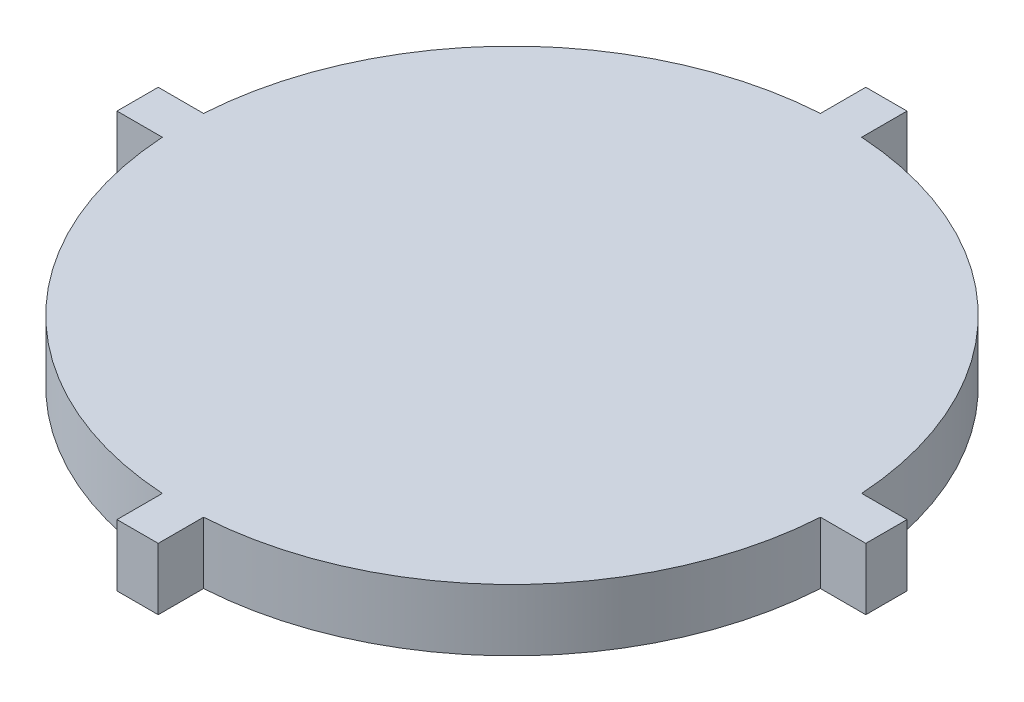
ISO-10303-21;
HEADER;
FILE_DESCRIPTION(('STEP AP214'),'2;1');
FILE_NAME('part.step','',(''),(''),'','','');
FILE_SCHEMA(('AUTOMOTIVE_DESIGN { 1 0 10303 214 1 1 1 1 }'));
ENDSEC;
DATA;
#1=APPLICATION_CONTEXT('core data for automotive mechanical design processes');
#2=APPLICATION_PROTOCOL_DEFINITION('international standard','automotive_design',2000,#1);
#3=PRODUCT_CONTEXT('',#1,'mechanical');
#4=PRODUCT('Part','Part','',(#3));
#5=PRODUCT_RELATED_PRODUCT_CATEGORY('part','',(#4));
#6=PRODUCT_DEFINITION_FORMATION('','',#4);
#7=PRODUCT_DEFINITION_CONTEXT('part definition',#1,'design');
#8=PRODUCT_DEFINITION('design','',#6,#7);
#9=PRODUCT_DEFINITION_SHAPE('','',#8);
#10=(LENGTH_UNIT() NAMED_UNIT(*) SI_UNIT(.MILLI.,.METRE.));
#11=(NAMED_UNIT(*) PLANE_ANGLE_UNIT() SI_UNIT($,.RADIAN.));
#12=(NAMED_UNIT(*) SI_UNIT($,.STERADIAN.) SOLID_ANGLE_UNIT());
#13=UNCERTAINTY_MEASURE_WITH_UNIT(LENGTH_MEASURE(1.E-05),#10,'distance_accuracy_value','');
#14=(GEOMETRIC_REPRESENTATION_CONTEXT(3) GLOBAL_UNCERTAINTY_ASSIGNED_CONTEXT((#13)) GLOBAL_UNIT_ASSIGNED_CONTEXT((#10,
#11,#12)) REPRESENTATION_CONTEXT('',''));
#15=CARTESIAN_POINT('',(0.,0.,0.));
#16=DIRECTION('',(0.,0.,1.));
#17=DIRECTION('',(1.,0.,0.));
#18=AXIS2_PLACEMENT_3D('',#15,#16,#17);
#19=CARTESIAN_POINT('',(0.,19.05,0.));
#20=DIRECTION('',(0.,-1.,0.));
#21=DIRECTION('',(0.,0.,-1.));
#22=AXIS2_PLACEMENT_3D('',#19,#20,#21);
#23=CYLINDRICAL_SURFACE('',#22,101.6);
#24=CARTESIAN_POINT('',(0.,0.,0.));
#25=DIRECTION('',(0.,1.,0.));
#26=DIRECTION('',(0.,0.,1.));
#27=AXIS2_PLACEMENT_3D('',#24,#25,#26);
#28=CIRCLE('',#27,101.6);
#29=CARTESIAN_POINT('',(101.401368333963,0.,-6.35));
#30=VERTEX_POINT('',#29);
#31=CARTESIAN_POINT('',(6.35000000000001,0.,-101.401368333963));
#32=VERTEX_POINT('',#31);
#33=EDGE_CURVE('E187',#30,#32,#28,.T.);
#34=ORIENTED_EDGE('',*,*,#33,.T.);
#35=DIRECTION('',(0.,-1.,0.));
#36=VECTOR('',#35,1.);
#37=CARTESIAN_POINT('',(6.35000000000001,19.05,-101.401368333963));
#38=LINE('',#37,#36);
#39=CARTESIAN_POINT('',(6.35000000000001,19.05,-101.401368333963));
#40=VERTEX_POINT('',#39);
#41=EDGE_CURVE('E11',#40,#32,#38,.T.);
#42=ORIENTED_EDGE('',*,*,#41,.F.);
#43=CARTESIAN_POINT('',(0.,19.05,0.));
#44=DIRECTION('',(0.,1.,0.));
#45=DIRECTION('',(0.,0.,1.));
#46=AXIS2_PLACEMENT_3D('',#43,#44,#45);
#47=CIRCLE('',#46,101.6);
#48=CARTESIAN_POINT('',(101.401368333963,19.05,-6.35));
#49=VERTEX_POINT('',#48);
#50=EDGE_CURVE('E217',#49,#40,#47,.T.);
#51=ORIENTED_EDGE('',*,*,#50,.F.);
#52=DIRECTION('',(0.,-1.,0.));
#53=VECTOR('',#52,1.);
#54=CARTESIAN_POINT('',(101.401368333963,19.05,-6.35));
#55=LINE('',#54,#53);
#56=EDGE_CURVE('E183',#49,#30,#55,.T.);
#57=ORIENTED_EDGE('',*,*,#56,.T.);
#58=EDGE_LOOP('',(#34,#42,#51,#57));
#59=FACE_BOUND('',#58,.T.);
#60=ADVANCED_FACE('F43',(#59),#23,.T.);
#61=CARTESIAN_POINT('',(6.35000000000001,19.05,-101.401368333963));
#62=DIRECTION('',(-1.,0.,0.));
#63=DIRECTION('',(0.,0.,1.));
#64=AXIS2_PLACEMENT_3D('',#61,#62,#63);
#65=PLANE('',#64);
#66=DIRECTION('',(0.,0.,-1.));
#67=VECTOR('',#66,1.);
#68=CARTESIAN_POINT('',(6.35000000000001,0.,-101.401368333963));
#69=LINE('',#68,#67);
#70=CARTESIAN_POINT('',(6.35,0.,-115.371368333963));
#71=VERTEX_POINT('',#70);
#72=EDGE_CURVE('E190',#32,#71,#69,.T.);
#73=ORIENTED_EDGE('',*,*,#72,.T.);
#74=DIRECTION('',(0.,-1.,0.));
#75=VECTOR('',#74,1.);
#76=CARTESIAN_POINT('',(6.35,19.05,-115.371368333963));
#77=LINE('',#76,#75);
#78=CARTESIAN_POINT('',(6.35,19.05,-115.371368333963));
#79=VERTEX_POINT('',#78);
#80=EDGE_CURVE('E51',#79,#71,#77,.T.);
#81=ORIENTED_EDGE('',*,*,#80,.F.);
#82=DIRECTION('',(0.,0.,-1.));
#83=VECTOR('',#82,1.);
#84=CARTESIAN_POINT('',(6.35000000000001,19.05,-101.401368333963));
#85=LINE('',#84,#83);
#86=EDGE_CURVE('E125',#40,#79,#85,.T.);
#87=ORIENTED_EDGE('',*,*,#86,.F.);
#88=ORIENTED_EDGE('',*,*,#41,.T.);
#89=EDGE_LOOP('',(#73,#81,#87,#88));
#90=FACE_BOUND('',#89,.T.);
#91=ADVANCED_FACE('F315',(#90),#65,.F.);
#92=CARTESIAN_POINT('',(-6.35,19.05,-115.371368333963));
#93=DIRECTION('',(0.,0.,1.));
#94=DIRECTION('',(1.,0.,0.));
#95=AXIS2_PLACEMENT_3D('',#92,#93,#94);
#96=PLANE('',#95);
#97=DIRECTION('',(-1.,0.,0.));
#98=VECTOR('',#97,1.);
#99=CARTESIAN_POINT('',(-6.35,0.,-115.371368333963));
#100=LINE('',#99,#98);
#101=CARTESIAN_POINT('',(-6.35,0.,-115.371368333963));
#102=VERTEX_POINT('',#101);
#103=EDGE_CURVE('E192',#71,#102,#100,.T.);
#104=ORIENTED_EDGE('',*,*,#103,.T.);
#105=DIRECTION('',(0.,-1.,0.));
#106=VECTOR('',#105,1.);
#107=CARTESIAN_POINT('',(-6.35,19.05,-115.371368333963));
#108=LINE('',#107,#106);
#109=CARTESIAN_POINT('',(-6.35,19.05,-115.371368333963));
#110=VERTEX_POINT('',#109);
#111=EDGE_CURVE('E248',#110,#102,#108,.T.);
#112=ORIENTED_EDGE('',*,*,#111,.F.);
#113=DIRECTION('',(-1.,0.,0.));
#114=VECTOR('',#113,1.);
#115=CARTESIAN_POINT('',(-6.35,19.05,-115.371368333963));
#116=LINE('',#115,#114);
#117=EDGE_CURVE('E256',#79,#110,#116,.T.);
#118=ORIENTED_EDGE('',*,*,#117,.F.);
#119=ORIENTED_EDGE('',*,*,#80,.T.);
#120=EDGE_LOOP('',(#104,#112,#118,#119));
#121=FACE_BOUND('',#120,.T.);
#122=ADVANCED_FACE('F254',(#121),#96,.F.);
#123=CARTESIAN_POINT('',(-6.34999999999999,19.05,-101.401368333963));
#124=DIRECTION('',(1.,0.,0.));
#125=DIRECTION('',(0.,0.,-1.));
#126=AXIS2_PLACEMENT_3D('',#123,#124,#125);
#127=PLANE('',#126);
#128=DIRECTION('',(0.,0.,1.));
#129=VECTOR('',#128,1.);
#130=CARTESIAN_POINT('',(-6.34999999999999,0.,-101.401368333963));
#131=LINE('',#130,#129);
#132=CARTESIAN_POINT('',(-6.34999999999999,0.,-101.401368333963));
#133=VERTEX_POINT('',#132);
#134=EDGE_CURVE('E194',#102,#133,#131,.T.);
#135=ORIENTED_EDGE('',*,*,#134,.T.);
#136=DIRECTION('',(0.,-1.,0.));
#137=VECTOR('',#136,1.);
#138=CARTESIAN_POINT('',(-6.34999999999999,19.05,-101.401368333963));
#139=LINE('',#138,#137);
#140=CARTESIAN_POINT('',(-6.34999999999999,19.05,-101.401368333963));
#141=VERTEX_POINT('',#140);
#142=EDGE_CURVE('E245',#141,#133,#139,.T.);
#143=ORIENTED_EDGE('',*,*,#142,.F.);
#144=DIRECTION('',(0.,0.,1.));
#145=VECTOR('',#144,1.);
#146=CARTESIAN_POINT('',(-6.34999999999999,19.05,-101.401368333963));
#147=LINE('',#146,#145);
#148=EDGE_CURVE('E274',#110,#141,#147,.T.);
#149=ORIENTED_EDGE('',*,*,#148,.F.);
#150=ORIENTED_EDGE('',*,*,#111,.T.);
#151=EDGE_LOOP('',(#135,#143,#149,#150));
#152=FACE_BOUND('',#151,.T.);
#153=ADVANCED_FACE('F265',(#152),#127,.F.);
#154=CARTESIAN_POINT('',(0.,19.05,0.));
#155=DIRECTION('',(0.,-1.,0.));
#156=DIRECTION('',(0.,0.,-1.));
#157=AXIS2_PLACEMENT_3D('',#154,#155,#156);
#158=CYLINDRICAL_SURFACE('',#157,101.6);
#159=CARTESIAN_POINT('',(0.,0.,0.));
#160=DIRECTION('',(0.,1.,0.));
#161=DIRECTION('',(0.,0.,1.));
#162=AXIS2_PLACEMENT_3D('',#159,#160,#161);
#163=CIRCLE('',#162,101.6);
#164=CARTESIAN_POINT('',(-101.401368333963,0.,-6.34999999999998));
#165=VERTEX_POINT('',#164);
#166=EDGE_CURVE('E196',#133,#165,#163,.T.);
#167=ORIENTED_EDGE('',*,*,#166,.T.);
#168=DIRECTION('',(0.,-1.,0.));
#169=VECTOR('',#168,1.);
#170=CARTESIAN_POINT('',(-101.401368333963,19.05,-6.34999999999998));
#171=LINE('',#170,#169);
#172=CARTESIAN_POINT('',(-101.401368333963,19.05,-6.34999999999998));
#173=VERTEX_POINT('',#172);
#174=EDGE_CURVE('E242',#173,#165,#171,.T.);
#175=ORIENTED_EDGE('',*,*,#174,.F.);
#176=CARTESIAN_POINT('',(0.,19.05,0.));
#177=DIRECTION('',(0.,1.,0.));
#178=DIRECTION('',(0.,0.,1.));
#179=AXIS2_PLACEMENT_3D('',#176,#177,#178);
#180=CIRCLE('',#179,101.6);
#181=EDGE_CURVE('E271',#141,#173,#180,.T.);
#182=ORIENTED_EDGE('',*,*,#181,.F.);
#183=ORIENTED_EDGE('',*,*,#142,.T.);
#184=EDGE_LOOP('',(#167,#175,#182,#183));
#185=FACE_BOUND('',#184,.T.);
#186=ADVANCED_FACE('F269',(#185),#158,.T.);
#187=CARTESIAN_POINT('',(-101.401368333963,19.05,-6.35));
#188=DIRECTION('',(0.,0.,1.));
#189=DIRECTION('',(1.,0.,0.));
#190=AXIS2_PLACEMENT_3D('',#187,#188,#189);
#191=PLANE('',#190);
#192=DIRECTION('',(-1.,0.,0.));
#193=VECTOR('',#192,1.);
#194=CARTESIAN_POINT('',(-101.401368333963,0.,-6.35));
#195=LINE('',#194,#193);
#196=CARTESIAN_POINT('',(-115.371368333963,0.,-6.35000000000072));
#197=VERTEX_POINT('',#196);
#198=EDGE_CURVE('E198',#165,#197,#195,.T.);
#199=ORIENTED_EDGE('',*,*,#198,.T.);
#200=DIRECTION('',(0.,-1.,0.));
#201=VECTOR('',#200,1.);
#202=CARTESIAN_POINT('',(-115.371368333963,19.05,-6.35000000000072));
#203=LINE('',#202,#201);
#204=CARTESIAN_POINT('',(-115.371368333963,19.05,-6.35000000000072));
#205=VERTEX_POINT('',#204);
#206=EDGE_CURVE('E239',#205,#197,#203,.T.);
#207=ORIENTED_EDGE('',*,*,#206,.F.);
#208=DIRECTION('',(-1.,0.,0.));
#209=VECTOR('',#208,1.);
#210=CARTESIAN_POINT('',(-101.401368333963,19.05,-6.35));
#211=LINE('',#210,#209);
#212=EDGE_CURVE('E273',#173,#205,#211,.T.);
#213=ORIENTED_EDGE('',*,*,#212,.F.);
#214=ORIENTED_EDGE('',*,*,#174,.T.);
#215=EDGE_LOOP('',(#199,#207,#213,#214));
#216=FACE_BOUND('',#215,.T.);
#217=ADVANCED_FACE('F328',(#216),#191,.F.);
#218=CARTESIAN_POINT('',(-115.371368333963,19.05,-6.35000000000072));
#219=DIRECTION('',(1.,0.,0.));
#220=DIRECTION('',(0.,0.,-1.));
#221=AXIS2_PLACEMENT_3D('',#218,#219,#220);
#222=PLANE('',#221);
#223=DIRECTION('',(0.,0.,1.));
#224=VECTOR('',#223,1.);
#225=CARTESIAN_POINT('',(-115.371368333963,0.,-6.35000000000072));
#226=LINE('',#225,#224);
#227=CARTESIAN_POINT('',(-115.371368333963,0.,6.34999999999928));
#228=VERTEX_POINT('',#227);
#229=EDGE_CURVE('E200',#197,#228,#226,.T.);
#230=ORIENTED_EDGE('',*,*,#229,.T.);
#231=DIRECTION('',(0.,-1.,0.));
#232=VECTOR('',#231,1.);
#233=CARTESIAN_POINT('',(-115.371368333963,19.05,6.34999999999928));
#234=LINE('',#233,#232);
#235=CARTESIAN_POINT('',(-115.371368333963,19.05,6.34999999999928));
#236=VERTEX_POINT('',#235);
#237=EDGE_CURVE('E236',#236,#228,#234,.T.);
#238=ORIENTED_EDGE('',*,*,#237,.F.);
#239=DIRECTION('',(0.,0.,1.));
#240=VECTOR('',#239,1.);
#241=CARTESIAN_POINT('',(-115.371368333963,19.05,-6.35000000000072));
#242=LINE('',#241,#240);
#243=EDGE_CURVE('E276',#205,#236,#242,.T.);
#244=ORIENTED_EDGE('',*,*,#243,.F.);
#245=ORIENTED_EDGE('',*,*,#206,.T.);
#246=EDGE_LOOP('',(#230,#238,#244,#245));
#247=FACE_BOUND('',#246,.T.);
#248=ADVANCED_FACE('F331',(#247),#222,.F.);
#249=CARTESIAN_POINT('',(-101.401368333963,19.05,6.35));
#250=DIRECTION('',(0.,0.,-1.));
#251=DIRECTION('',(-1.,0.,0.));
#252=AXIS2_PLACEMENT_3D('',#249,#250,#251);
#253=PLANE('',#252);
#254=DIRECTION('',(1.,0.,0.));
#255=VECTOR('',#254,1.);
#256=CARTESIAN_POINT('',(-101.401368333963,0.,6.35));
#257=LINE('',#256,#255);
#258=CARTESIAN_POINT('',(-101.401368333963,0.,6.35));
#259=VERTEX_POINT('',#258);
#260=EDGE_CURVE('E202',#228,#259,#257,.T.);
#261=ORIENTED_EDGE('',*,*,#260,.T.);
#262=DIRECTION('',(0.,-1.,0.));
#263=VECTOR('',#262,1.);
#264=CARTESIAN_POINT('',(-101.401368333963,19.05,6.35));
#265=LINE('',#264,#263);
#266=CARTESIAN_POINT('',(-101.401368333963,19.05,6.35));
#267=VERTEX_POINT('',#266);
#268=EDGE_CURVE('E233',#267,#259,#265,.T.);
#269=ORIENTED_EDGE('',*,*,#268,.F.);
#270=DIRECTION('',(1.,0.,0.));
#271=VECTOR('',#270,1.);
#272=CARTESIAN_POINT('',(-101.401368333963,19.05,6.35));
#273=LINE('',#272,#271);
#274=EDGE_CURVE('E282',#236,#267,#273,.T.);
#275=ORIENTED_EDGE('',*,*,#274,.F.);
#276=ORIENTED_EDGE('',*,*,#237,.T.);
#277=EDGE_LOOP('',(#261,#269,#275,#276));
#278=FACE_BOUND('',#277,.T.);
#279=ADVANCED_FACE('F335',(#278),#253,.F.);
#280=CARTESIAN_POINT('',(0.,19.05,0.));
#281=DIRECTION('',(0.,-1.,0.));
#282=DIRECTION('',(0.,0.,-1.));
#283=AXIS2_PLACEMENT_3D('',#280,#281,#282);
#284=CYLINDRICAL_SURFACE('',#283,101.6);
#285=CARTESIAN_POINT('',(0.,0.,0.));
#286=DIRECTION('',(0.,1.,0.));
#287=DIRECTION('',(0.,0.,1.));
#288=AXIS2_PLACEMENT_3D('',#285,#286,#287);
#289=CIRCLE('',#288,101.6);
#290=CARTESIAN_POINT('',(-6.34999999999999,0.,101.401368333963));
#291=VERTEX_POINT('',#290);
#292=EDGE_CURVE('E204',#259,#291,#289,.T.);
#293=ORIENTED_EDGE('',*,*,#292,.T.);
#294=DIRECTION('',(0.,-1.,0.));
#295=VECTOR('',#294,1.);
#296=CARTESIAN_POINT('',(-6.34999999999999,19.05,101.401368333963));
#297=LINE('',#296,#295);
#298=CARTESIAN_POINT('',(-6.34999999999999,19.05,101.401368333963));
#299=VERTEX_POINT('',#298);
#300=EDGE_CURVE('E230',#299,#291,#297,.T.);
#301=ORIENTED_EDGE('',*,*,#300,.F.);
#302=CARTESIAN_POINT('',(0.,19.05,0.));
#303=DIRECTION('',(0.,1.,0.));
#304=DIRECTION('',(0.,0.,1.));
#305=AXIS2_PLACEMENT_3D('',#302,#303,#304);
#306=CIRCLE('',#305,101.6);
#307=EDGE_CURVE('E284',#267,#299,#306,.T.);
#308=ORIENTED_EDGE('',*,*,#307,.F.);
#309=ORIENTED_EDGE('',*,*,#268,.T.);
#310=EDGE_LOOP('',(#293,#301,#308,#309));
#311=FACE_BOUND('',#310,.T.);
#312=ADVANCED_FACE('F339',(#311),#284,.T.);
#313=CARTESIAN_POINT('',(-6.34999999999999,19.05,101.401368333963));
#314=DIRECTION('',(1.,0.,0.));
#315=DIRECTION('',(0.,0.,-1.));
#316=AXIS2_PLACEMENT_3D('',#313,#314,#315);
#317=PLANE('',#316);
#318=DIRECTION('',(0.,0.,1.));
#319=VECTOR('',#318,1.);
#320=CARTESIAN_POINT('',(-6.34999999999999,0.,101.401368333963));
#321=LINE('',#320,#319);
#322=CARTESIAN_POINT('',(-6.34999999999999,0.,115.371368333963));
#323=VERTEX_POINT('',#322);
#324=EDGE_CURVE('E206',#291,#323,#321,.T.);
#325=ORIENTED_EDGE('',*,*,#324,.T.);
#326=DIRECTION('',(0.,-1.,0.));
#327=VECTOR('',#326,1.);
#328=CARTESIAN_POINT('',(-6.34999999999999,19.05,115.371368333963));
#329=LINE('',#328,#327);
#330=CARTESIAN_POINT('',(-6.34999999999999,19.05,115.371368333963));
#331=VERTEX_POINT('',#330);
#332=EDGE_CURVE('E227',#331,#323,#329,.T.);
#333=ORIENTED_EDGE('',*,*,#332,.F.);
#334=DIRECTION('',(0.,0.,1.));
#335=VECTOR('',#334,1.);
#336=CARTESIAN_POINT('',(-6.34999999999999,19.05,101.401368333963));
#337=LINE('',#336,#335);
#338=EDGE_CURVE('E286',#299,#331,#337,.T.);
#339=ORIENTED_EDGE('',*,*,#338,.F.);
#340=ORIENTED_EDGE('',*,*,#300,.T.);
#341=EDGE_LOOP('',(#325,#333,#339,#340));
#342=FACE_BOUND('',#341,.T.);
#343=ADVANCED_FACE('F343',(#342),#317,.F.);
#344=CARTESIAN_POINT('',(-6.34999999999999,19.05,115.371368333963));
#345=DIRECTION('',(0.,0.,-1.));
#346=DIRECTION('',(-1.,0.,0.));
#347=AXIS2_PLACEMENT_3D('',#344,#345,#346);
#348=PLANE('',#347);
#349=DIRECTION('',(1.,0.,0.));
#350=VECTOR('',#349,1.);
#351=CARTESIAN_POINT('',(-6.34999999999999,0.,115.371368333963));
#352=LINE('',#351,#350);
#353=CARTESIAN_POINT('',(6.35000000000001,0.,115.371368333963));
#354=VERTEX_POINT('',#353);
#355=EDGE_CURVE('E208',#323,#354,#352,.T.);
#356=ORIENTED_EDGE('',*,*,#355,.T.);
#357=DIRECTION('',(0.,-1.,0.));
#358=VECTOR('',#357,1.);
#359=CARTESIAN_POINT('',(6.35000000000001,19.05,115.371368333963));
#360=LINE('',#359,#358);
#361=CARTESIAN_POINT('',(6.35000000000001,19.05,115.371368333963));
#362=VERTEX_POINT('',#361);
#363=EDGE_CURVE('E224',#362,#354,#360,.T.);
#364=ORIENTED_EDGE('',*,*,#363,.F.);
#365=DIRECTION('',(1.,0.,0.));
#366=VECTOR('',#365,1.);
#367=CARTESIAN_POINT('',(-6.34999999999999,19.05,115.371368333963));
#368=LINE('',#367,#366);
#369=EDGE_CURVE('E288',#331,#362,#368,.T.);
#370=ORIENTED_EDGE('',*,*,#369,.F.);
#371=ORIENTED_EDGE('',*,*,#332,.T.);
#372=EDGE_LOOP('',(#356,#364,#370,#371));
#373=FACE_BOUND('',#372,.T.);
#374=ADVANCED_FACE('F347',(#373),#348,.F.);
#375=CARTESIAN_POINT('',(6.35000000000001,19.05,101.401368333963));
#376=DIRECTION('',(-1.,0.,0.));
#377=DIRECTION('',(0.,0.,1.));
#378=AXIS2_PLACEMENT_3D('',#375,#376,#377);
#379=PLANE('',#378);
#380=DIRECTION('',(0.,0.,-1.));
#381=VECTOR('',#380,1.);
#382=CARTESIAN_POINT('',(6.35000000000001,0.,101.401368333963));
#383=LINE('',#382,#381);
#384=CARTESIAN_POINT('',(6.35000000000001,0.,101.401368333963));
#385=VERTEX_POINT('',#384);
#386=EDGE_CURVE('E210',#354,#385,#383,.T.);
#387=ORIENTED_EDGE('',*,*,#386,.T.);
#388=DIRECTION('',(0.,-1.,0.));
#389=VECTOR('',#388,1.);
#390=CARTESIAN_POINT('',(6.35000000000001,19.05,101.401368333963));
#391=LINE('',#390,#389);
#392=CARTESIAN_POINT('',(6.35000000000001,19.05,101.401368333963));
#393=VERTEX_POINT('',#392);
#394=EDGE_CURVE('E221',#393,#385,#391,.T.);
#395=ORIENTED_EDGE('',*,*,#394,.F.);
#396=DIRECTION('',(0.,0.,-1.));
#397=VECTOR('',#396,1.);
#398=CARTESIAN_POINT('',(6.35000000000001,19.05,101.401368333963));
#399=LINE('',#398,#397);
#400=EDGE_CURVE('E290',#362,#393,#399,.T.);
#401=ORIENTED_EDGE('',*,*,#400,.F.);
#402=ORIENTED_EDGE('',*,*,#363,.T.);
#403=EDGE_LOOP('',(#387,#395,#401,#402));
#404=FACE_BOUND('',#403,.T.);
#405=ADVANCED_FACE('F296',(#404),#379,.F.);
#406=CARTESIAN_POINT('',(0.,19.05,0.));
#407=DIRECTION('',(0.,-1.,0.));
#408=DIRECTION('',(0.,0.,-1.));
#409=AXIS2_PLACEMENT_3D('',#406,#407,#408);
#410=CYLINDRICAL_SURFACE('',#409,101.6);
#411=CARTESIAN_POINT('',(0.,0.,0.));
#412=DIRECTION('',(0.,1.,0.));
#413=DIRECTION('',(0.,0.,1.));
#414=AXIS2_PLACEMENT_3D('',#411,#412,#413);
#415=CIRCLE('',#414,101.6);
#416=CARTESIAN_POINT('',(101.401368333963,0.,6.34999999999999));
#417=VERTEX_POINT('',#416);
#418=EDGE_CURVE('E212',#385,#417,#415,.T.);
#419=ORIENTED_EDGE('',*,*,#418,.T.);
#420=DIRECTION('',(0.,-1.,0.));
#421=VECTOR('',#420,1.);
#422=CARTESIAN_POINT('',(101.401368333963,19.05,6.34999999999999));
#423=LINE('',#422,#421);
#424=CARTESIAN_POINT('',(101.401368333963,19.05,6.34999999999999));
#425=VERTEX_POINT('',#424);
#426=EDGE_CURVE('E178',#425,#417,#423,.T.);
#427=ORIENTED_EDGE('',*,*,#426,.F.);
#428=CARTESIAN_POINT('',(0.,19.05,0.));
#429=DIRECTION('',(0.,1.,0.));
#430=DIRECTION('',(0.,0.,1.));
#431=AXIS2_PLACEMENT_3D('',#428,#429,#430);
#432=CIRCLE('',#431,101.6);
#433=EDGE_CURVE('E168',#393,#425,#432,.T.);
#434=ORIENTED_EDGE('',*,*,#433,.F.);
#435=ORIENTED_EDGE('',*,*,#394,.T.);
#436=EDGE_LOOP('',(#419,#427,#434,#435));
#437=FACE_BOUND('',#436,.T.);
#438=ADVANCED_FACE('F300',(#437),#410,.T.);
#439=CARTESIAN_POINT('',(115.371368333963,19.05,6.35));
#440=DIRECTION('',(0.,0.,-1.));
#441=DIRECTION('',(-1.,0.,0.));
#442=AXIS2_PLACEMENT_3D('',#439,#440,#441);
#443=PLANE('',#442);
#444=DIRECTION('',(1.,0.,0.));
#445=VECTOR('',#444,1.);
#446=CARTESIAN_POINT('',(115.371368333963,0.,6.35));
#447=LINE('',#446,#445);
#448=CARTESIAN_POINT('',(115.371368333963,0.,6.35));
#449=VERTEX_POINT('',#448);
#450=EDGE_CURVE('E177',#417,#449,#447,.T.);
#451=ORIENTED_EDGE('',*,*,#450,.T.);
#452=DIRECTION('',(0.,-1.,0.));
#453=VECTOR('',#452,1.);
#454=CARTESIAN_POINT('',(115.371368333963,19.05,6.35));
#455=LINE('',#454,#453);
#456=CARTESIAN_POINT('',(115.371368333963,19.05,6.35));
#457=VERTEX_POINT('',#456);
#458=EDGE_CURVE('E174',#457,#449,#455,.T.);
#459=ORIENTED_EDGE('',*,*,#458,.F.);
#460=DIRECTION('',(1.,0.,0.));
#461=VECTOR('',#460,1.);
#462=CARTESIAN_POINT('',(115.371368333963,19.05,6.35));
#463=LINE('',#462,#461);
#464=EDGE_CURVE('E162',#425,#457,#463,.T.);
#465=ORIENTED_EDGE('',*,*,#464,.F.);
#466=ORIENTED_EDGE('',*,*,#426,.T.);
#467=EDGE_LOOP('',(#451,#459,#465,#466));
#468=FACE_BOUND('',#467,.T.);
#469=ADVANCED_FACE('F175',(#468),#443,.F.);
#470=CARTESIAN_POINT('',(115.371368333963,19.05,3.17500000000013));
#471=DIRECTION('',(-1.,0.,0.));
#472=DIRECTION('',(0.,0.,1.));
#473=AXIS2_PLACEMENT_3D('',#470,#471,#472);
#474=PLANE('',#473);
#475=DIRECTION('',(0.,0.,-1.));
#476=VECTOR('',#475,1.);
#477=CARTESIAN_POINT('',(115.371368333963,0.,3.17500000000013));
#478=LINE('',#477,#476);
#479=CARTESIAN_POINT('',(115.371368333963,0.,-6.35));
#480=VERTEX_POINT('',#479);
#481=EDGE_CURVE('E111',#449,#480,#478,.T.);
#482=ORIENTED_EDGE('',*,*,#481,.T.);
#483=DIRECTION('',(0.,-1.,0.));
#484=VECTOR('',#483,1.);
#485=CARTESIAN_POINT('',(115.371368333963,19.05,-6.35));
#486=LINE('',#485,#484);
#487=CARTESIAN_POINT('',(115.371368333963,19.05,-6.35));
#488=VERTEX_POINT('',#487);
#489=EDGE_CURVE('E179',#488,#480,#486,.T.);
#490=ORIENTED_EDGE('',*,*,#489,.F.);
#491=DIRECTION('',(0.,0.,-1.));
#492=VECTOR('',#491,1.);
#493=CARTESIAN_POINT('',(115.371368333963,19.05,3.17500000000013));
#494=LINE('',#493,#492);
#495=EDGE_CURVE('E166',#457,#488,#494,.T.);
#496=ORIENTED_EDGE('',*,*,#495,.F.);
#497=ORIENTED_EDGE('',*,*,#458,.T.);
#498=EDGE_LOOP('',(#482,#490,#496,#497));
#499=FACE_BOUND('',#498,.T.);
#500=ADVANCED_FACE('F181',(#499),#474,.F.);
#501=CARTESIAN_POINT('',(115.371368333963,19.05,-6.35));
#502=DIRECTION('',(0.,0.,1.));
#503=DIRECTION('',(1.,0.,0.));
#504=AXIS2_PLACEMENT_3D('',#501,#502,#503);
#505=PLANE('',#504);
#506=DIRECTION('',(-1.,0.,0.));
#507=VECTOR('',#506,1.);
#508=CARTESIAN_POINT('',(115.371368333963,0.,-6.35));
#509=LINE('',#508,#507);
#510=EDGE_CURVE('E117',#480,#30,#509,.T.);
#511=ORIENTED_EDGE('',*,*,#510,.T.);
#512=ORIENTED_EDGE('',*,*,#56,.F.);
#513=DIRECTION('',(-1.,0.,0.));
#514=VECTOR('',#513,1.);
#515=CARTESIAN_POINT('',(115.371368333963,19.05,-6.35));
#516=LINE('',#515,#514);
#517=EDGE_CURVE('E59',#488,#49,#516,.T.);
#518=ORIENTED_EDGE('',*,*,#517,.F.);
#519=ORIENTED_EDGE('',*,*,#489,.T.);
#520=EDGE_LOOP('',(#511,#512,#518,#519));
#521=FACE_BOUND('',#520,.T.);
#522=ADVANCED_FACE('F304',(#521),#505,.F.);
#523=CARTESIAN_POINT('',(0.,19.05,0.));
#524=DIRECTION('',(0.,1.,0.));
#525=DIRECTION('',(0.,0.,1.));
#526=AXIS2_PLACEMENT_3D('',#523,#524,#525);
#527=PLANE('',#526);
#528=ORIENTED_EDGE('',*,*,#50,.T.);
#529=ORIENTED_EDGE('',*,*,#86,.T.);
#530=ORIENTED_EDGE('',*,*,#117,.T.);
#531=ORIENTED_EDGE('',*,*,#148,.T.);
#532=ORIENTED_EDGE('',*,*,#181,.T.);
#533=ORIENTED_EDGE('',*,*,#212,.T.);
#534=ORIENTED_EDGE('',*,*,#243,.T.);
#535=ORIENTED_EDGE('',*,*,#274,.T.);
#536=ORIENTED_EDGE('',*,*,#307,.T.);
#537=ORIENTED_EDGE('',*,*,#338,.T.);
#538=ORIENTED_EDGE('',*,*,#369,.T.);
#539=ORIENTED_EDGE('',*,*,#400,.T.);
#540=ORIENTED_EDGE('',*,*,#433,.T.);
#541=ORIENTED_EDGE('',*,*,#464,.T.);
#542=ORIENTED_EDGE('',*,*,#495,.T.);
#543=ORIENTED_EDGE('',*,*,#517,.T.);
#544=EDGE_LOOP('',(#528,#529,#530,#531,#532,#533,#534,#535,#536,#537,#538,#539,#540,#541,#542,#543));
#545=FACE_BOUND('',#544,.T.);
#546=ADVANCED_FACE('F164',(#545),#527,.T.);
#547=CARTESIAN_POINT('',(0.,0.,0.));
#548=DIRECTION('',(0.,1.,0.));
#549=DIRECTION('',(0.,0.,1.));
#550=AXIS2_PLACEMENT_3D('',#547,#548,#549);
#551=PLANE('',#550);
#552=ORIENTED_EDGE('',*,*,#33,.F.);
#553=ORIENTED_EDGE('',*,*,#510,.F.);
#554=ORIENTED_EDGE('',*,*,#481,.F.);
#555=ORIENTED_EDGE('',*,*,#450,.F.);
#556=ORIENTED_EDGE('',*,*,#418,.F.);
#557=ORIENTED_EDGE('',*,*,#386,.F.);
#558=ORIENTED_EDGE('',*,*,#355,.F.);
#559=ORIENTED_EDGE('',*,*,#324,.F.);
#560=ORIENTED_EDGE('',*,*,#292,.F.);
#561=ORIENTED_EDGE('',*,*,#260,.F.);
#562=ORIENTED_EDGE('',*,*,#229,.F.);
#563=ORIENTED_EDGE('',*,*,#198,.F.);
#564=ORIENTED_EDGE('',*,*,#166,.F.);
#565=ORIENTED_EDGE('',*,*,#134,.F.);
#566=ORIENTED_EDGE('',*,*,#103,.F.);
#567=ORIENTED_EDGE('',*,*,#72,.F.);
#568=EDGE_LOOP('',(#552,#553,#554,#555,#556,#557,#558,#559,#560,#561,#562,#563,#564,#565,#566,#567));
#569=FACE_BOUND('',#568,.T.);
#570=ADVANCED_FACE('F260',(#569),#551,.F.);
#571=CLOSED_SHELL('',(#60,#91,#122,#153,#186,#217,#248,#279,#312,#343,#374,#405,#438,#469,#500,
#522,#546,#570));
#572=MANIFOLD_SOLID_BREP('B2',#571);
#573=ADVANCED_BREP_SHAPE_REPRESENTATION('',(#18,#572),#14);
#574=SHAPE_DEFINITION_REPRESENTATION(#9,#573);
ENDSEC;
END-ISO-10303-21;
